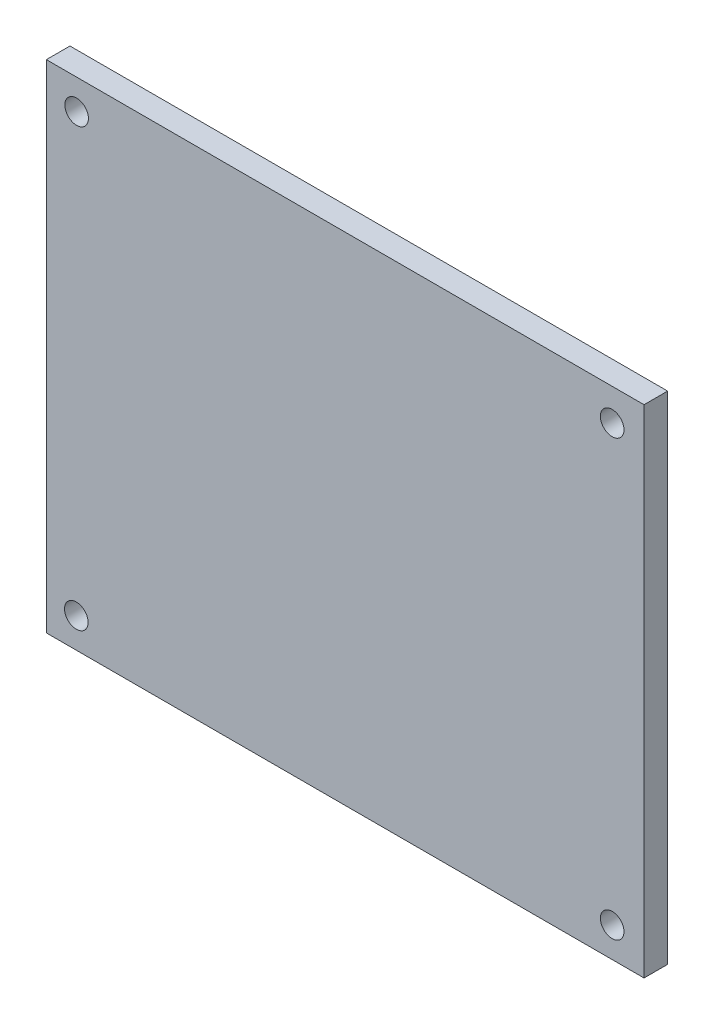
ISO-10303-21;
HEADER;
FILE_DESCRIPTION(('STEP AP214'),'2;1');
FILE_NAME('part.step','',(''),(''),'','','');
FILE_SCHEMA(('AUTOMOTIVE_DESIGN { 1 0 10303 214 1 1 1 1 }'));
ENDSEC;
DATA;
#1=APPLICATION_CONTEXT('core data for automotive mechanical design processes');
#2=APPLICATION_PROTOCOL_DEFINITION('international standard','automotive_design',2000,#1);
#3=PRODUCT_CONTEXT('',#1,'mechanical');
#4=PRODUCT('Part','Part','',(#3));
#5=PRODUCT_RELATED_PRODUCT_CATEGORY('part','',(#4));
#6=PRODUCT_DEFINITION_FORMATION('','',#4);
#7=PRODUCT_DEFINITION_CONTEXT('part definition',#1,'design');
#8=PRODUCT_DEFINITION('design','',#6,#7);
#9=PRODUCT_DEFINITION_SHAPE('','',#8);
#10=(LENGTH_UNIT() NAMED_UNIT(*) SI_UNIT(.MILLI.,.METRE.));
#11=(NAMED_UNIT(*) PLANE_ANGLE_UNIT() SI_UNIT($,.RADIAN.));
#12=(NAMED_UNIT(*) SI_UNIT($,.STERADIAN.) SOLID_ANGLE_UNIT());
#13=UNCERTAINTY_MEASURE_WITH_UNIT(LENGTH_MEASURE(1.E-05),#10,'distance_accuracy_value','');
#14=(GEOMETRIC_REPRESENTATION_CONTEXT(3) GLOBAL_UNCERTAINTY_ASSIGNED_CONTEXT((#13)) GLOBAL_UNIT_ASSIGNED_CONTEXT((#10,
#11,#12)) REPRESENTATION_CONTEXT('',''));
#15=CARTESIAN_POINT('',(0.,0.,0.));
#16=DIRECTION('',(0.,0.,1.));
#17=DIRECTION('',(1.,0.,0.));
#18=AXIS2_PLACEMENT_3D('',#15,#16,#17);
#19=CARTESIAN_POINT('',(0.,0.,3.2));
#20=DIRECTION('',(1.,0.,0.));
#21=DIRECTION('',(0.,0.,-1.));
#22=AXIS2_PLACEMENT_3D('',#19,#20,#21);
#23=PLANE('',#22);
#24=DIRECTION('',(0.,-1.,0.));
#25=VECTOR('',#24,1.);
#26=CARTESIAN_POINT('',(0.,0.,0.));
#27=LINE('',#26,#25);
#28=CARTESIAN_POINT('',(0.,67.31,0.));
#29=VERTEX_POINT('',#28);
#30=CARTESIAN_POINT('',(0.,0.,0.));
#31=VERTEX_POINT('',#30);
#32=EDGE_CURVE('E107',#29,#31,#27,.T.);
#33=ORIENTED_EDGE('',*,*,#32,.T.);
#34=DIRECTION('',(0.,0.,-1.));
#35=VECTOR('',#34,1.);
#36=CARTESIAN_POINT('',(0.,0.,3.2));
#37=LINE('',#36,#35);
#38=CARTESIAN_POINT('',(0.,0.,3.2));
#39=VERTEX_POINT('',#38);
#40=EDGE_CURVE('E11',#39,#31,#37,.T.);
#41=ORIENTED_EDGE('',*,*,#40,.F.);
#42=DIRECTION('',(0.,-1.,0.));
#43=VECTOR('',#42,1.);
#44=CARTESIAN_POINT('',(0.,0.,3.2));
#45=LINE('',#44,#43);
#46=CARTESIAN_POINT('',(0.,67.31,3.2));
#47=VERTEX_POINT('',#46);
#48=EDGE_CURVE('E91',#47,#39,#45,.T.);
#49=ORIENTED_EDGE('',*,*,#48,.F.);
#50=DIRECTION('',(0.,0.,-1.));
#51=VECTOR('',#50,1.);
#52=CARTESIAN_POINT('',(0.,67.31,3.2));
#53=LINE('',#52,#51);
#54=EDGE_CURVE('E103',#47,#29,#53,.T.);
#55=ORIENTED_EDGE('',*,*,#54,.T.);
#56=EDGE_LOOP('',(#33,#41,#49,#55));
#57=FACE_BOUND('',#56,.T.);
#58=ADVANCED_FACE('F39',(#57),#23,.F.);
#59=CARTESIAN_POINT('',(0.,0.,3.2));
#60=DIRECTION('',(0.,1.,0.));
#61=DIRECTION('',(0.,0.,1.));
#62=AXIS2_PLACEMENT_3D('',#59,#60,#61);
#63=PLANE('',#62);
#64=DIRECTION('',(1.,0.,0.));
#65=VECTOR('',#64,1.);
#66=CARTESIAN_POINT('',(0.,0.,0.));
#67=LINE('',#66,#65);
#68=CARTESIAN_POINT('',(81.026,0.,0.));
#69=VERTEX_POINT('',#68);
#70=EDGE_CURVE('E96',#31,#69,#67,.T.);
#71=ORIENTED_EDGE('',*,*,#70,.T.);
#72=DIRECTION('',(0.,0.,-1.));
#73=VECTOR('',#72,1.);
#74=CARTESIAN_POINT('',(81.026,0.,3.2));
#75=LINE('',#74,#73);
#76=CARTESIAN_POINT('',(81.026,0.,3.2));
#77=VERTEX_POINT('',#76);
#78=EDGE_CURVE('E48',#77,#69,#75,.T.);
#79=ORIENTED_EDGE('',*,*,#78,.F.);
#80=DIRECTION('',(1.,0.,0.));
#81=VECTOR('',#80,1.);
#82=CARTESIAN_POINT('',(0.,0.,3.2));
#83=LINE('',#82,#81);
#84=EDGE_CURVE('E86',#39,#77,#83,.T.);
#85=ORIENTED_EDGE('',*,*,#84,.F.);
#86=ORIENTED_EDGE('',*,*,#40,.T.);
#87=EDGE_LOOP('',(#71,#79,#85,#86));
#88=FACE_BOUND('',#87,.T.);
#89=ADVANCED_FACE('F95',(#88),#63,.F.);
#90=CARTESIAN_POINT('',(81.026,0.,3.2));
#91=DIRECTION('',(-1.,0.,0.));
#92=DIRECTION('',(0.,0.,1.));
#93=AXIS2_PLACEMENT_3D('',#90,#91,#92);
#94=PLANE('',#93);
#95=DIRECTION('',(0.,1.,0.));
#96=VECTOR('',#95,1.);
#97=CARTESIAN_POINT('',(81.026,0.,0.));
#98=LINE('',#97,#96);
#99=CARTESIAN_POINT('',(81.026,67.31,0.));
#100=VERTEX_POINT('',#99);
#101=EDGE_CURVE('E73',#69,#100,#98,.T.);
#102=ORIENTED_EDGE('',*,*,#101,.T.);
#103=DIRECTION('',(0.,0.,-1.));
#104=VECTOR('',#103,1.);
#105=CARTESIAN_POINT('',(81.026,67.31,3.2));
#106=LINE('',#105,#104);
#107=CARTESIAN_POINT('',(81.026,67.31,3.2));
#108=VERTEX_POINT('',#107);
#109=EDGE_CURVE('E98',#108,#100,#106,.T.);
#110=ORIENTED_EDGE('',*,*,#109,.F.);
#111=DIRECTION('',(0.,1.,0.));
#112=VECTOR('',#111,1.);
#113=CARTESIAN_POINT('',(81.026,0.,3.2));
#114=LINE('',#113,#112);
#115=EDGE_CURVE('E89',#77,#108,#114,.T.);
#116=ORIENTED_EDGE('',*,*,#115,.F.);
#117=ORIENTED_EDGE('',*,*,#78,.T.);
#118=EDGE_LOOP('',(#102,#110,#116,#117));
#119=FACE_BOUND('',#118,.T.);
#120=ADVANCED_FACE('F99',(#119),#94,.F.);
#121=CARTESIAN_POINT('',(0.,67.31,3.2));
#122=DIRECTION('',(0.,-1.,0.));
#123=DIRECTION('',(0.,0.,-1.));
#124=AXIS2_PLACEMENT_3D('',#121,#122,#123);
#125=PLANE('',#124);
#126=DIRECTION('',(-1.,0.,0.));
#127=VECTOR('',#126,1.);
#128=CARTESIAN_POINT('',(0.,67.31,0.));
#129=LINE('',#128,#127);
#130=EDGE_CURVE('E79',#100,#29,#129,.T.);
#131=ORIENTED_EDGE('',*,*,#130,.T.);
#132=ORIENTED_EDGE('',*,*,#54,.F.);
#133=DIRECTION('',(-1.,0.,0.));
#134=VECTOR('',#133,1.);
#135=CARTESIAN_POINT('',(0.,67.31,3.2));
#136=LINE('',#135,#134);
#137=EDGE_CURVE('E56',#108,#47,#136,.T.);
#138=ORIENTED_EDGE('',*,*,#137,.F.);
#139=ORIENTED_EDGE('',*,*,#109,.T.);
#140=EDGE_LOOP('',(#131,#132,#138,#139));
#141=FACE_BOUND('',#140,.T.);
#142=ADVANCED_FACE('F121',(#141),#125,.F.);
#143=CARTESIAN_POINT('',(0.,0.,3.2));
#144=DIRECTION('',(0.,0.,-1.));
#145=DIRECTION('',(-1.,0.,0.));
#146=AXIS2_PLACEMENT_3D('',#143,#144,#145);
#147=PLANE('',#146);
#148=CARTESIAN_POINT('',(76.708,4.064,3.2));
#149=DIRECTION('',(0.,0.,1.));
#150=DIRECTION('',(1.,0.,0.));
#151=AXIS2_PLACEMENT_3D('',#148,#149,#150);
#152=CIRCLE('',#151,1.60000000000001);
#153=CARTESIAN_POINT('',(78.308,4.064,3.2));
#154=VERTEX_POINT('',#153);
#155=EDGE_CURVE('E141',#154,#154,#152,.T.);
#156=ORIENTED_EDGE('',*,*,#155,.F.);
#157=EDGE_LOOP('',(#156));
#158=FACE_BOUND('',#157,.T.);
#159=CARTESIAN_POINT('',(76.708,62.992,3.2));
#160=DIRECTION('',(0.,0.,1.));
#161=DIRECTION('',(1.,0.,0.));
#162=AXIS2_PLACEMENT_3D('',#159,#160,#161);
#163=CIRCLE('',#162,1.60000000000001);
#164=CARTESIAN_POINT('',(78.308,62.992,3.2));
#165=VERTEX_POINT('',#164);
#166=EDGE_CURVE('E140',#165,#165,#163,.T.);
#167=ORIENTED_EDGE('',*,*,#166,.F.);
#168=EDGE_LOOP('',(#167));
#169=FACE_BOUND('',#168,.T.);
#170=CARTESIAN_POINT('',(4.1021,63.246,3.2));
#171=DIRECTION('',(0.,0.,1.));
#172=DIRECTION('',(1.,0.,0.));
#173=AXIS2_PLACEMENT_3D('',#170,#171,#172);
#174=CIRCLE('',#173,1.6);
#175=CARTESIAN_POINT('',(5.7021,63.246,3.2));
#176=VERTEX_POINT('',#175);
#177=EDGE_CURVE('E149',#176,#176,#174,.T.);
#178=ORIENTED_EDGE('',*,*,#177,.F.);
#179=EDGE_LOOP('',(#178));
#180=FACE_BOUND('',#179,.T.);
#181=CARTESIAN_POINT('',(4.064,4.064,3.2));
#182=DIRECTION('',(0.,0.,1.));
#183=DIRECTION('',(1.,0.,0.));
#184=AXIS2_PLACEMENT_3D('',#181,#182,#183);
#185=CIRCLE('',#184,1.6);
#186=CARTESIAN_POINT('',(5.664,4.064,3.2));
#187=VERTEX_POINT('',#186);
#188=EDGE_CURVE('E131',#187,#187,#185,.T.);
#189=ORIENTED_EDGE('',*,*,#188,.F.);
#190=EDGE_LOOP('',(#189));
#191=FACE_BOUND('',#190,.T.);
#192=ORIENTED_EDGE('',*,*,#48,.T.);
#193=ORIENTED_EDGE('',*,*,#84,.T.);
#194=ORIENTED_EDGE('',*,*,#115,.T.);
#195=ORIENTED_EDGE('',*,*,#137,.T.);
#196=EDGE_LOOP('',(#192,#193,#194,#195));
#197=FACE_BOUND('',#196,.T.);
#198=ADVANCED_FACE('F87',(#158,#169,#180,#191,#197),#147,.F.);
#199=CARTESIAN_POINT('',(0.,0.,0.));
#200=DIRECTION('',(0.,0.,-1.));
#201=DIRECTION('',(-1.,0.,0.));
#202=AXIS2_PLACEMENT_3D('',#199,#200,#201);
#203=PLANE('',#202);
#204=CARTESIAN_POINT('',(76.708,4.064,0.));
#205=DIRECTION('',(0.,0.,-1.));
#206=DIRECTION('',(-1.,0.,0.));
#207=AXIS2_PLACEMENT_3D('',#204,#205,#206);
#208=CIRCLE('',#207,1.60000000000001);
#209=CARTESIAN_POINT('',(75.108,4.064,0.));
#210=VERTEX_POINT('',#209);
#211=EDGE_CURVE('E136',#210,#210,#208,.F.);
#212=ORIENTED_EDGE('',*,*,#211,.T.);
#213=EDGE_LOOP('',(#212));
#214=FACE_BOUND('',#213,.T.);
#215=CARTESIAN_POINT('',(76.708,62.992,0.));
#216=DIRECTION('',(0.,0.,-1.));
#217=DIRECTION('',(-1.,0.,0.));
#218=AXIS2_PLACEMENT_3D('',#215,#216,#217);
#219=CIRCLE('',#218,1.60000000000001);
#220=CARTESIAN_POINT('',(75.108,62.992,0.));
#221=VERTEX_POINT('',#220);
#222=EDGE_CURVE('E145',#221,#221,#219,.F.);
#223=ORIENTED_EDGE('',*,*,#222,.T.);
#224=EDGE_LOOP('',(#223));
#225=FACE_BOUND('',#224,.T.);
#226=CARTESIAN_POINT('',(4.1021,63.246,0.));
#227=DIRECTION('',(0.,0.,-1.));
#228=DIRECTION('',(-1.,0.,0.));
#229=AXIS2_PLACEMENT_3D('',#226,#227,#228);
#230=CIRCLE('',#229,1.6);
#231=CARTESIAN_POINT('',(2.5021,63.246,0.));
#232=VERTEX_POINT('',#231);
#233=EDGE_CURVE('E135',#232,#232,#230,.F.);
#234=ORIENTED_EDGE('',*,*,#233,.T.);
#235=EDGE_LOOP('',(#234));
#236=FACE_BOUND('',#235,.T.);
#237=CARTESIAN_POINT('',(4.064,4.064,0.));
#238=DIRECTION('',(0.,0.,-1.));
#239=DIRECTION('',(-1.,0.,0.));
#240=AXIS2_PLACEMENT_3D('',#237,#238,#239);
#241=CIRCLE('',#240,1.6);
#242=CARTESIAN_POINT('',(2.464,4.064,0.));
#243=VERTEX_POINT('',#242);
#244=EDGE_CURVE('E111',#243,#243,#241,.F.);
#245=ORIENTED_EDGE('',*,*,#244,.T.);
#246=EDGE_LOOP('',(#245));
#247=FACE_BOUND('',#246,.T.);
#248=ORIENTED_EDGE('',*,*,#32,.F.);
#249=ORIENTED_EDGE('',*,*,#130,.F.);
#250=ORIENTED_EDGE('',*,*,#101,.F.);
#251=ORIENTED_EDGE('',*,*,#70,.F.);
#252=EDGE_LOOP('',(#248,#249,#250,#251));
#253=FACE_BOUND('',#252,.T.);
#254=ADVANCED_FACE('F124',(#214,#225,#236,#247,#253),#203,.T.);
#255=CARTESIAN_POINT('',(4.064,4.064,-4.52548339959392));
#256=DIRECTION('',(0.,0.,1.));
#257=DIRECTION('',(1.,0.,0.));
#258=AXIS2_PLACEMENT_3D('',#255,#256,#257);
#259=CYLINDRICAL_SURFACE('',#258,1.6);
#260=ORIENTED_EDGE('',*,*,#188,.T.);
#261=EDGE_LOOP('',(#260));
#262=FACE_BOUND('',#261,.T.);
#263=ORIENTED_EDGE('',*,*,#244,.F.);
#264=EDGE_LOOP('',(#263));
#265=FACE_BOUND('',#264,.T.);
#266=ADVANCED_FACE('F169',(#262,#265),#259,.F.);
#267=CARTESIAN_POINT('',(4.1021,63.246,-4.52548339959392));
#268=DIRECTION('',(0.,0.,1.));
#269=DIRECTION('',(1.,0.,0.));
#270=AXIS2_PLACEMENT_3D('',#267,#268,#269);
#271=CYLINDRICAL_SURFACE('',#270,1.6);
#272=ORIENTED_EDGE('',*,*,#177,.T.);
#273=EDGE_LOOP('',(#272));
#274=FACE_BOUND('',#273,.T.);
#275=ORIENTED_EDGE('',*,*,#233,.F.);
#276=EDGE_LOOP('',(#275));
#277=FACE_BOUND('',#276,.T.);
#278=ADVANCED_FACE('F160',(#274,#277),#271,.F.);
#279=CARTESIAN_POINT('',(76.708,62.992,-4.52548339959392));
#280=DIRECTION('',(0.,0.,1.));
#281=DIRECTION('',(1.,0.,0.));
#282=AXIS2_PLACEMENT_3D('',#279,#280,#281);
#283=CYLINDRICAL_SURFACE('',#282,1.60000000000001);
#284=ORIENTED_EDGE('',*,*,#166,.T.);
#285=EDGE_LOOP('',(#284));
#286=FACE_BOUND('',#285,.T.);
#287=ORIENTED_EDGE('',*,*,#222,.F.);
#288=EDGE_LOOP('',(#287));
#289=FACE_BOUND('',#288,.T.);
#290=ADVANCED_FACE('F218',(#286,#289),#283,.F.);
#291=CARTESIAN_POINT('',(76.708,4.064,-4.52548339959392));
#292=DIRECTION('',(0.,0.,1.));
#293=DIRECTION('',(1.,0.,0.));
#294=AXIS2_PLACEMENT_3D('',#291,#292,#293);
#295=CYLINDRICAL_SURFACE('',#294,1.60000000000001);
#296=ORIENTED_EDGE('',*,*,#155,.T.);
#297=EDGE_LOOP('',(#296));
#298=FACE_BOUND('',#297,.T.);
#299=ORIENTED_EDGE('',*,*,#211,.F.);
#300=EDGE_LOOP('',(#299));
#301=FACE_BOUND('',#300,.T.);
#302=ADVANCED_FACE('F227',(#298,#301),#295,.F.);
#303=CLOSED_SHELL('',(#58,#89,#120,#142,#198,#254,#266,#278,#290,#302));
#304=MANIFOLD_SOLID_BREP('B2',#303);
#305=ADVANCED_BREP_SHAPE_REPRESENTATION('',(#18,#304),#14);
#306=SHAPE_DEFINITION_REPRESENTATION(#9,#305);
ENDSEC;
END-ISO-10303-21;
